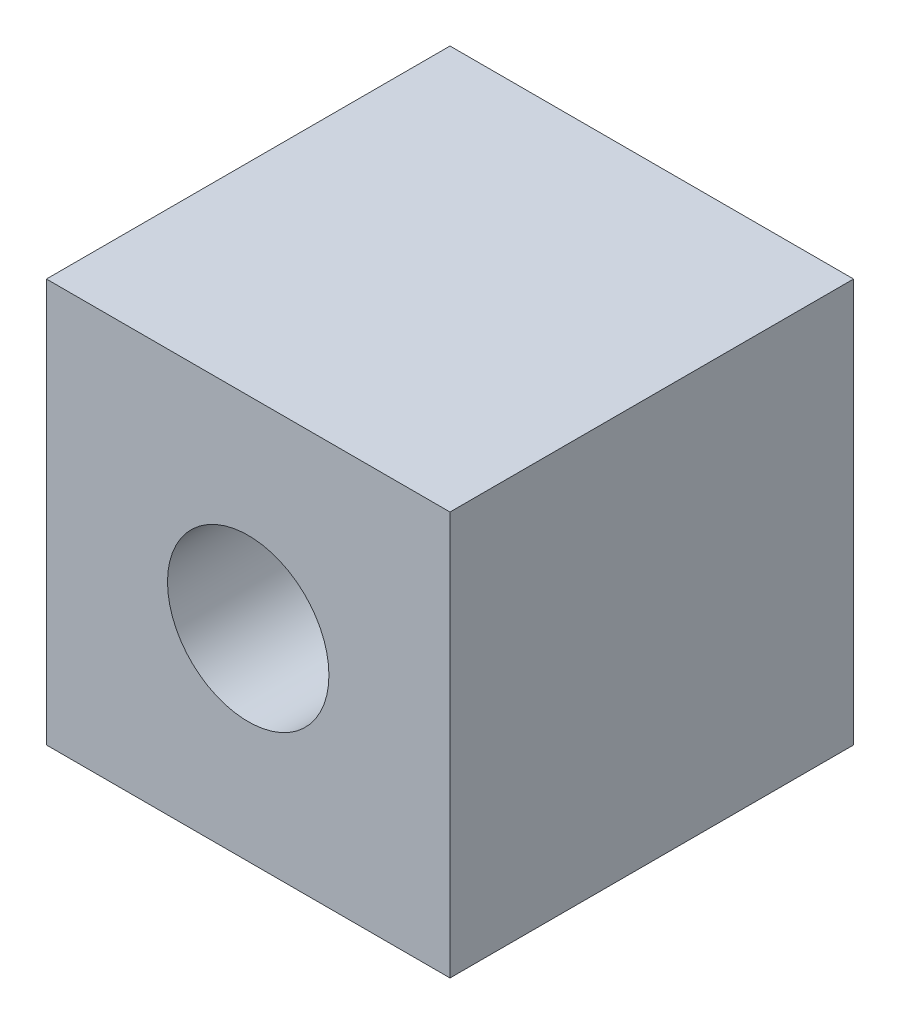
ISO-10303-21;
HEADER;
FILE_DESCRIPTION(('STEP AP214'),'2;1');
FILE_NAME('part.step','',(''),(''),'','','');
FILE_SCHEMA(('AUTOMOTIVE_DESIGN { 1 0 10303 214 1 1 1 1 }'));
ENDSEC;
DATA;
#1=APPLICATION_CONTEXT('core data for automotive mechanical design processes');
#2=APPLICATION_PROTOCOL_DEFINITION('international standard','automotive_design',2000,#1);
#3=PRODUCT_CONTEXT('',#1,'mechanical');
#4=PRODUCT('Part','Part','',(#3));
#5=PRODUCT_RELATED_PRODUCT_CATEGORY('part','',(#4));
#6=PRODUCT_DEFINITION_FORMATION('','',#4);
#7=PRODUCT_DEFINITION_CONTEXT('part definition',#1,'design');
#8=PRODUCT_DEFINITION('design','',#6,#7);
#9=PRODUCT_DEFINITION_SHAPE('','',#8);
#10=(LENGTH_UNIT() NAMED_UNIT(*) SI_UNIT(.MILLI.,.METRE.));
#11=(NAMED_UNIT(*) PLANE_ANGLE_UNIT() SI_UNIT($,.RADIAN.));
#12=(NAMED_UNIT(*) SI_UNIT($,.STERADIAN.) SOLID_ANGLE_UNIT());
#13=UNCERTAINTY_MEASURE_WITH_UNIT(LENGTH_MEASURE(1.E-05),#10,'distance_accuracy_value','');
#14=(GEOMETRIC_REPRESENTATION_CONTEXT(3) GLOBAL_UNCERTAINTY_ASSIGNED_CONTEXT((#13)) GLOBAL_UNIT_ASSIGNED_CONTEXT((#10,
#11,#12)) REPRESENTATION_CONTEXT('',''));
#15=CARTESIAN_POINT('',(0.,0.,0.));
#16=DIRECTION('',(0.,0.,1.));
#17=DIRECTION('',(1.,0.,0.));
#18=AXIS2_PLACEMENT_3D('',#15,#16,#17);
#19=CARTESIAN_POINT('',(25.,-25.,50.));
#20=DIRECTION('',(-1.,0.,0.));
#21=DIRECTION('',(0.,0.,1.));
#22=AXIS2_PLACEMENT_3D('',#19,#20,#21);
#23=PLANE('',#22);
#24=DIRECTION('',(0.,1.,0.));
#25=VECTOR('',#24,1.);
#26=CARTESIAN_POINT('',(25.,-25.,0.));
#27=LINE('',#26,#25);
#28=CARTESIAN_POINT('',(25.,-25.,0.));
#29=VERTEX_POINT('',#28);
#30=CARTESIAN_POINT('',(25.,25.,0.));
#31=VERTEX_POINT('',#30);
#32=EDGE_CURVE('E100',#29,#31,#27,.T.);
#33=ORIENTED_EDGE('',*,*,#32,.T.);
#34=DIRECTION('',(0.,0.,-1.));
#35=VECTOR('',#34,1.);
#36=CARTESIAN_POINT('',(25.,25.,50.));
#37=LINE('',#36,#35);
#38=CARTESIAN_POINT('',(25.,25.,50.));
#39=VERTEX_POINT('',#38);
#40=EDGE_CURVE('E11',#39,#31,#37,.T.);
#41=ORIENTED_EDGE('',*,*,#40,.F.);
#42=DIRECTION('',(0.,1.,0.));
#43=VECTOR('',#42,1.);
#44=CARTESIAN_POINT('',(25.,-25.,50.));
#45=LINE('',#44,#43);
#46=CARTESIAN_POINT('',(25.,-25.,50.));
#47=VERTEX_POINT('',#46);
#48=EDGE_CURVE('E88',#47,#39,#45,.T.);
#49=ORIENTED_EDGE('',*,*,#48,.F.);
#50=DIRECTION('',(0.,0.,-1.));
#51=VECTOR('',#50,1.);
#52=CARTESIAN_POINT('',(25.,-25.,50.));
#53=LINE('',#52,#51);
#54=EDGE_CURVE('E96',#47,#29,#53,.T.);
#55=ORIENTED_EDGE('',*,*,#54,.T.);
#56=EDGE_LOOP('',(#33,#41,#49,#55));
#57=FACE_BOUND('',#56,.T.);
#58=ADVANCED_FACE('F37',(#57),#23,.F.);
#59=CARTESIAN_POINT('',(-25.,25.,50.));
#60=DIRECTION('',(0.,-1.,0.));
#61=DIRECTION('',(0.,0.,-1.));
#62=AXIS2_PLACEMENT_3D('',#59,#60,#61);
#63=PLANE('',#62);
#64=DIRECTION('',(-1.,0.,0.));
#65=VECTOR('',#64,1.);
#66=CARTESIAN_POINT('',(-25.,25.,0.));
#67=LINE('',#66,#65);
#68=CARTESIAN_POINT('',(-25.,25.,0.));
#69=VERTEX_POINT('',#68);
#70=EDGE_CURVE('E92',#31,#69,#67,.T.);
#71=ORIENTED_EDGE('',*,*,#70,.T.);
#72=DIRECTION('',(0.,0.,-1.));
#73=VECTOR('',#72,1.);
#74=CARTESIAN_POINT('',(-25.,25.,50.));
#75=LINE('',#74,#73);
#76=CARTESIAN_POINT('',(-25.,25.,50.));
#77=VERTEX_POINT('',#76);
#78=EDGE_CURVE('E45',#77,#69,#75,.T.);
#79=ORIENTED_EDGE('',*,*,#78,.F.);
#80=DIRECTION('',(-1.,0.,0.));
#81=VECTOR('',#80,1.);
#82=CARTESIAN_POINT('',(-25.,25.,50.));
#83=LINE('',#82,#81);
#84=EDGE_CURVE('E83',#39,#77,#83,.T.);
#85=ORIENTED_EDGE('',*,*,#84,.F.);
#86=ORIENTED_EDGE('',*,*,#40,.T.);
#87=EDGE_LOOP('',(#71,#79,#85,#86));
#88=FACE_BOUND('',#87,.T.);
#89=ADVANCED_FACE('F91',(#88),#63,.F.);
#90=CARTESIAN_POINT('',(-25.,-25.,50.));
#91=DIRECTION('',(1.,0.,0.));
#92=DIRECTION('',(0.,0.,-1.));
#93=AXIS2_PLACEMENT_3D('',#90,#91,#92);
#94=PLANE('',#93);
#95=DIRECTION('',(0.,-1.,0.));
#96=VECTOR('',#95,1.);
#97=CARTESIAN_POINT('',(-25.,-25.,0.));
#98=LINE('',#97,#96);
#99=CARTESIAN_POINT('',(-25.,-25.,0.));
#100=VERTEX_POINT('',#99);
#101=EDGE_CURVE('E70',#69,#100,#98,.T.);
#102=ORIENTED_EDGE('',*,*,#101,.T.);
#103=DIRECTION('',(0.,0.,-1.));
#104=VECTOR('',#103,1.);
#105=CARTESIAN_POINT('',(-25.,-25.,50.));
#106=LINE('',#105,#104);
#107=CARTESIAN_POINT('',(-25.,-25.,50.));
#108=VERTEX_POINT('',#107);
#109=EDGE_CURVE('E93',#108,#100,#106,.T.);
#110=ORIENTED_EDGE('',*,*,#109,.F.);
#111=DIRECTION('',(0.,-1.,0.));
#112=VECTOR('',#111,1.);
#113=CARTESIAN_POINT('',(-25.,-25.,50.));
#114=LINE('',#113,#112);
#115=EDGE_CURVE('E86',#77,#108,#114,.T.);
#116=ORIENTED_EDGE('',*,*,#115,.F.);
#117=ORIENTED_EDGE('',*,*,#78,.T.);
#118=EDGE_LOOP('',(#102,#110,#116,#117));
#119=FACE_BOUND('',#118,.T.);
#120=ADVANCED_FACE('F94',(#119),#94,.F.);
#121=CARTESIAN_POINT('',(-25.,-25.,50.));
#122=DIRECTION('',(0.,1.,0.));
#123=DIRECTION('',(0.,0.,1.));
#124=AXIS2_PLACEMENT_3D('',#121,#122,#123);
#125=PLANE('',#124);
#126=DIRECTION('',(1.,0.,0.));
#127=VECTOR('',#126,1.);
#128=CARTESIAN_POINT('',(-25.,-25.,0.));
#129=LINE('',#128,#127);
#130=EDGE_CURVE('E76',#100,#29,#129,.T.);
#131=ORIENTED_EDGE('',*,*,#130,.T.);
#132=ORIENTED_EDGE('',*,*,#54,.F.);
#133=DIRECTION('',(1.,0.,0.));
#134=VECTOR('',#133,1.);
#135=CARTESIAN_POINT('',(-25.,-25.,50.));
#136=LINE('',#135,#134);
#137=EDGE_CURVE('E53',#108,#47,#136,.T.);
#138=ORIENTED_EDGE('',*,*,#137,.F.);
#139=ORIENTED_EDGE('',*,*,#109,.T.);
#140=EDGE_LOOP('',(#131,#132,#138,#139));
#141=FACE_BOUND('',#140,.T.);
#142=ADVANCED_FACE('F108',(#141),#125,.F.);
#143=CARTESIAN_POINT('',(0.,0.,50.));
#144=DIRECTION('',(0.,0.,-1.));
#145=DIRECTION('',(-1.,0.,0.));
#146=AXIS2_PLACEMENT_3D('',#143,#144,#145);
#147=PLANE('',#146);
#148=CARTESIAN_POINT('',(0.,0.,50.));
#149=DIRECTION('',(0.,0.,1.));
#150=DIRECTION('',(1.,0.,0.));
#151=AXIS2_PLACEMENT_3D('',#148,#149,#150);
#152=CIRCLE('',#151,10.);
#153=CARTESIAN_POINT('',(10.,0.,50.));
#154=VERTEX_POINT('',#153);
#155=EDGE_CURVE('E114',#154,#154,#152,.T.);
#156=ORIENTED_EDGE('',*,*,#155,.F.);
#157=EDGE_LOOP('',(#156));
#158=FACE_BOUND('',#157,.T.);
#159=ORIENTED_EDGE('',*,*,#48,.T.);
#160=ORIENTED_EDGE('',*,*,#84,.T.);
#161=ORIENTED_EDGE('',*,*,#115,.T.);
#162=ORIENTED_EDGE('',*,*,#137,.T.);
#163=EDGE_LOOP('',(#159,#160,#161,#162));
#164=FACE_BOUND('',#163,.T.);
#165=ADVANCED_FACE('F84',(#158,#164),#147,.F.);
#166=CARTESIAN_POINT('',(0.,0.,0.));
#167=DIRECTION('',(0.,0.,-1.));
#168=DIRECTION('',(-1.,0.,0.));
#169=AXIS2_PLACEMENT_3D('',#166,#167,#168);
#170=PLANE('',#169);
#171=CARTESIAN_POINT('',(0.,0.,0.));
#172=DIRECTION('',(0.,0.,1.));
#173=DIRECTION('',(1.,0.,0.));
#174=AXIS2_PLACEMENT_3D('',#171,#172,#173);
#175=CIRCLE('',#174,10.);
#176=CARTESIAN_POINT('',(10.,0.,0.));
#177=VERTEX_POINT('',#176);
#178=EDGE_CURVE('E103',#177,#177,#175,.T.);
#179=ORIENTED_EDGE('',*,*,#178,.T.);
#180=EDGE_LOOP('',(#179));
#181=FACE_BOUND('',#180,.T.);
#182=ORIENTED_EDGE('',*,*,#32,.F.);
#183=ORIENTED_EDGE('',*,*,#130,.F.);
#184=ORIENTED_EDGE('',*,*,#101,.F.);
#185=ORIENTED_EDGE('',*,*,#70,.F.);
#186=EDGE_LOOP('',(#182,#183,#184,#185));
#187=FACE_BOUND('',#186,.T.);
#188=ADVANCED_FACE('F111',(#181,#187),#170,.T.);
#189=CARTESIAN_POINT('',(0.,0.,0.));
#190=DIRECTION('',(0.,0.,1.));
#191=DIRECTION('',(1.,0.,0.));
#192=AXIS2_PLACEMENT_3D('',#189,#190,#191);
#193=CYLINDRICAL_SURFACE('',#192,10.);
#194=ORIENTED_EDGE('',*,*,#178,.F.);
#195=EDGE_LOOP('',(#194));
#196=FACE_BOUND('',#195,.T.);
#197=ORIENTED_EDGE('',*,*,#155,.T.);
#198=EDGE_LOOP('',(#197));
#199=FACE_BOUND('',#198,.T.);
#200=ADVANCED_FACE('F121',(#196,#199),#193,.F.);
#201=CLOSED_SHELL('',(#58,#89,#120,#142,#165,#188,#200));
#202=MANIFOLD_SOLID_BREP('B2',#201);
#203=ADVANCED_BREP_SHAPE_REPRESENTATION('',(#18,#202),#14);
#204=SHAPE_DEFINITION_REPRESENTATION(#9,#203);
ENDSEC;
END-ISO-10303-21;
